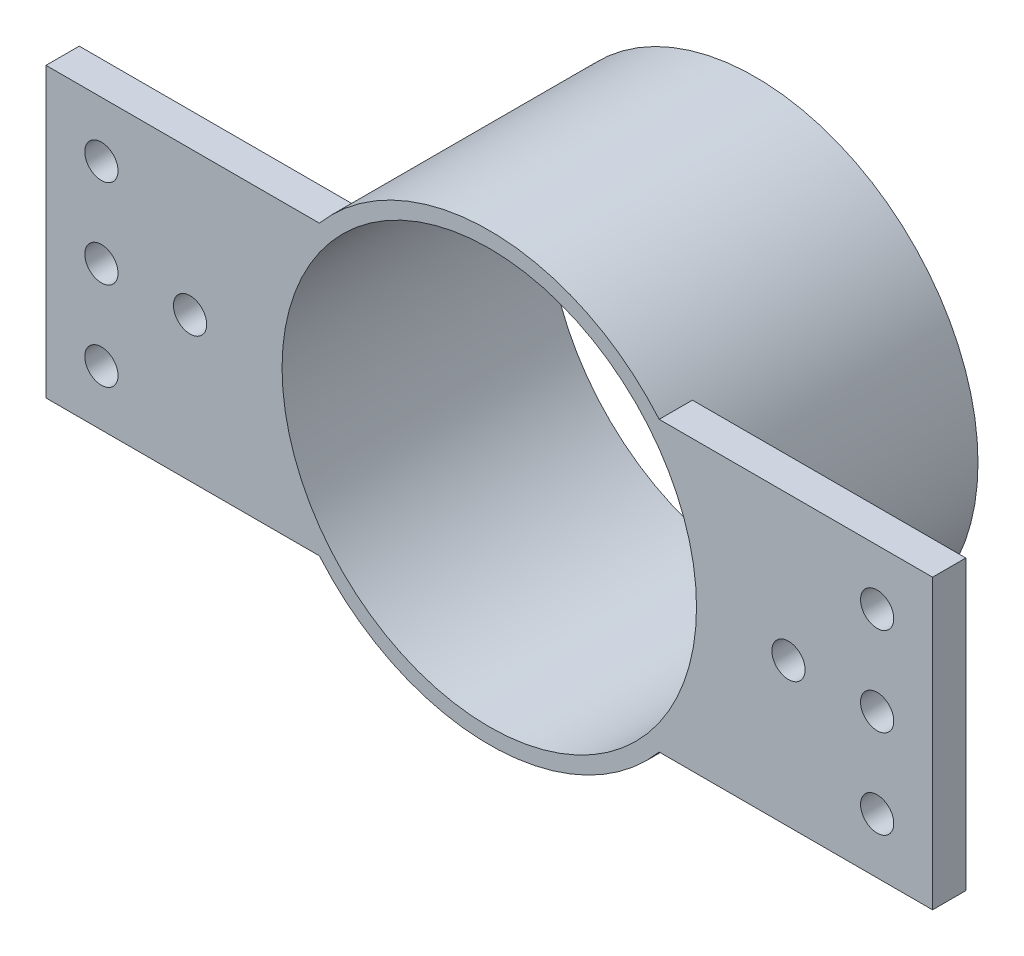
ISO-10303-21;
HEADER;
FILE_DESCRIPTION(('STEP AP214'),'2;1');
FILE_NAME('part.step','',(''),(''),'','','');
FILE_SCHEMA(('AUTOMOTIVE_DESIGN { 1 0 10303 214 1 1 1 1 }'));
ENDSEC;
DATA;
#1=APPLICATION_CONTEXT('core data for automotive mechanical design processes');
#2=APPLICATION_PROTOCOL_DEFINITION('international standard','automotive_design',2000,#1);
#3=PRODUCT_CONTEXT('',#1,'mechanical');
#4=PRODUCT('Part','Part','',(#3));
#5=PRODUCT_RELATED_PRODUCT_CATEGORY('part','',(#4));
#6=PRODUCT_DEFINITION_FORMATION('','',#4);
#7=PRODUCT_DEFINITION_CONTEXT('part definition',#1,'design');
#8=PRODUCT_DEFINITION('design','',#6,#7);
#9=PRODUCT_DEFINITION_SHAPE('','',#8);
#10=(LENGTH_UNIT() NAMED_UNIT(*) SI_UNIT(.MILLI.,.METRE.));
#11=(NAMED_UNIT(*) PLANE_ANGLE_UNIT() SI_UNIT($,.RADIAN.));
#12=(NAMED_UNIT(*) SI_UNIT($,.STERADIAN.) SOLID_ANGLE_UNIT());
#13=UNCERTAINTY_MEASURE_WITH_UNIT(LENGTH_MEASURE(1.E-05),#10,'distance_accuracy_value','');
#14=(GEOMETRIC_REPRESENTATION_CONTEXT(3) GLOBAL_UNCERTAINTY_ASSIGNED_CONTEXT((#13)) GLOBAL_UNIT_ASSIGNED_CONTEXT((#10,
#11,#12)) REPRESENTATION_CONTEXT('',''));
#15=CARTESIAN_POINT('',(0.,0.,0.));
#16=DIRECTION('',(0.,0.,1.));
#17=DIRECTION('',(1.,0.,0.));
#18=AXIS2_PLACEMENT_3D('',#15,#16,#17);
#19=CARTESIAN_POINT('',(0.,0.,0.));
#20=DIRECTION('',(0.,0.,1.));
#21=DIRECTION('',(1.,0.,0.));
#22=AXIS2_PLACEMENT_3D('',#19,#20,#21);
#23=PLANE('',#22);
#24=CARTESIAN_POINT('',(-35.,-8.,0.));
#25=DIRECTION('',(0.,0.,1.));
#26=DIRECTION('',(1.,0.,0.));
#27=AXIS2_PLACEMENT_3D('',#24,#25,#26);
#28=CIRCLE('',#27,1.5);
#29=CARTESIAN_POINT('',(-33.5,-8.,0.));
#30=VERTEX_POINT('',#29);
#31=EDGE_CURVE('E282',#30,#30,#28,.T.);
#32=ORIENTED_EDGE('',*,*,#31,.T.);
#33=EDGE_LOOP('',(#32));
#34=FACE_BOUND('',#33,.T.);
#35=CARTESIAN_POINT('',(-35.,8.,0.));
#36=DIRECTION('',(0.,0.,1.));
#37=DIRECTION('',(1.,0.,0.));
#38=AXIS2_PLACEMENT_3D('',#35,#36,#37);
#39=CIRCLE('',#38,1.5);
#40=CARTESIAN_POINT('',(-33.5,8.,0.));
#41=VERTEX_POINT('',#40);
#42=EDGE_CURVE('E276',#41,#41,#39,.T.);
#43=ORIENTED_EDGE('',*,*,#42,.T.);
#44=EDGE_LOOP('',(#43));
#45=FACE_BOUND('',#44,.T.);
#46=CARTESIAN_POINT('',(-27.,0.,0.));
#47=DIRECTION('',(0.,0.,1.));
#48=DIRECTION('',(1.,0.,0.));
#49=AXIS2_PLACEMENT_3D('',#46,#47,#48);
#50=CIRCLE('',#49,1.5);
#51=CARTESIAN_POINT('',(-25.5,0.,0.));
#52=VERTEX_POINT('',#51);
#53=EDGE_CURVE('E270',#52,#52,#50,.T.);
#54=ORIENTED_EDGE('',*,*,#53,.T.);
#55=EDGE_LOOP('',(#54));
#56=FACE_BOUND('',#55,.T.);
#57=CARTESIAN_POINT('',(-35.,0.,0.));
#58=DIRECTION('',(0.,0.,1.));
#59=DIRECTION('',(1.,0.,0.));
#60=AXIS2_PLACEMENT_3D('',#57,#58,#59);
#61=CIRCLE('',#60,1.5);
#62=CARTESIAN_POINT('',(-33.5,0.,0.));
#63=VERTEX_POINT('',#62);
#64=EDGE_CURVE('E265',#63,#63,#61,.T.);
#65=ORIENTED_EDGE('',*,*,#64,.T.);
#66=EDGE_LOOP('',(#65));
#67=FACE_BOUND('',#66,.T.);
#68=DIRECTION('',(-1.,0.,0.));
#69=VECTOR('',#68,1.);
#70=CARTESIAN_POINT('',(-40.,13.,0.));
#71=LINE('',#70,#69);
#72=CARTESIAN_POINT('',(-15.3300358773227,13.,0.));
#73=VERTEX_POINT('',#72);
#74=CARTESIAN_POINT('',(-40.,13.,0.));
#75=VERTEX_POINT('',#74);
#76=EDGE_CURVE('E141',#73,#75,#71,.T.);
#77=ORIENTED_EDGE('',*,*,#76,.F.);
#78=CARTESIAN_POINT('',(0.,0.,0.));
#79=DIRECTION('',(0.,0.,1.));
#80=DIRECTION('',(1.,0.,0.));
#81=AXIS2_PLACEMENT_3D('',#78,#79,#80);
#82=CIRCLE('',#81,20.1);
#83=CARTESIAN_POINT('',(-15.3300358773227,-13.,0.));
#84=VERTEX_POINT('',#83);
#85=EDGE_CURVE('E120',#73,#84,#82,.T.);
#86=ORIENTED_EDGE('',*,*,#85,.T.);
#87=DIRECTION('',(1.,0.,0.));
#88=VECTOR('',#87,1.);
#89=CARTESIAN_POINT('',(-40.,-13.,0.));
#90=LINE('',#89,#88);
#91=CARTESIAN_POINT('',(-40.,-13.,0.));
#92=VERTEX_POINT('',#91);
#93=EDGE_CURVE('E146',#92,#84,#90,.T.);
#94=ORIENTED_EDGE('',*,*,#93,.F.);
#95=DIRECTION('',(0.,-1.,0.));
#96=VECTOR('',#95,1.);
#97=CARTESIAN_POINT('',(-40.,13.,0.));
#98=LINE('',#97,#96);
#99=EDGE_CURVE('E144',#75,#92,#98,.T.);
#100=ORIENTED_EDGE('',*,*,#99,.F.);
#101=EDGE_LOOP('',(#77,#86,#94,#100));
#102=FACE_BOUND('',#101,.T.);
#103=ADVANCED_FACE('F34',(#34,#45,#56,#67,#102),#23,.F.);
#104=CARTESIAN_POINT('',(-40.,13.,3.));
#105=DIRECTION('',(0.,-1.,0.));
#106=DIRECTION('',(0.,0.,-1.));
#107=AXIS2_PLACEMENT_3D('',#104,#105,#106);
#108=PLANE('',#107);
#109=CARTESIAN_POINT('',(40.,13.,0.));
#110=VERTEX_POINT('',#109);
#111=CARTESIAN_POINT('',(15.3300358773227,13.,0.));
#112=VERTEX_POINT('',#111);
#113=EDGE_CURVE('E119',#110,#112,#71,.T.);
#114=ORIENTED_EDGE('',*,*,#113,.T.);
#115=DIRECTION('',(0.,0.,1.));
#116=VECTOR('',#115,1.);
#117=CARTESIAN_POINT('',(15.3300358773227,13.,-21.));
#118=LINE('',#117,#116);
#119=CARTESIAN_POINT('',(15.3300358773227,13.,3.));
#120=VERTEX_POINT('',#119);
#121=EDGE_CURVE('E110',#112,#120,#118,.T.);
#122=ORIENTED_EDGE('',*,*,#121,.T.);
#123=DIRECTION('',(-1.,0.,0.));
#124=VECTOR('',#123,1.);
#125=CARTESIAN_POINT('',(-40.,13.,3.));
#126=LINE('',#125,#124);
#127=CARTESIAN_POINT('',(40.,13.,3.));
#128=VERTEX_POINT('',#127);
#129=EDGE_CURVE('E85',#128,#120,#126,.T.);
#130=ORIENTED_EDGE('',*,*,#129,.F.);
#131=DIRECTION('',(0.,0.,-1.));
#132=VECTOR('',#131,1.);
#133=CARTESIAN_POINT('',(40.,13.,3.));
#134=LINE('',#133,#132);
#135=EDGE_CURVE('E156',#128,#110,#134,.T.);
#136=ORIENTED_EDGE('',*,*,#135,.T.);
#137=EDGE_LOOP('',(#114,#122,#130,#136));
#138=FACE_BOUND('',#137,.T.);
#139=ADVANCED_FACE('F118',(#138),#108,.F.);
#140=CARTESIAN_POINT('',(-40.,-13.,3.));
#141=DIRECTION('',(0.,1.,0.));
#142=DIRECTION('',(0.,0.,1.));
#143=AXIS2_PLACEMENT_3D('',#140,#141,#142);
#144=PLANE('',#143);
#145=ORIENTED_EDGE('',*,*,#93,.T.);
#146=DIRECTION('',(0.,0.,1.));
#147=VECTOR('',#146,1.);
#148=CARTESIAN_POINT('',(-15.3300358773227,-13.,-21.));
#149=LINE('',#148,#147);
#150=CARTESIAN_POINT('',(-15.3300358773227,-13.,3.));
#151=VERTEX_POINT('',#150);
#152=EDGE_CURVE('E11',#84,#151,#149,.T.);
#153=ORIENTED_EDGE('',*,*,#152,.T.);
#154=DIRECTION('',(1.,0.,0.));
#155=VECTOR('',#154,1.);
#156=CARTESIAN_POINT('',(-40.,-13.,3.));
#157=LINE('',#156,#155);
#158=CARTESIAN_POINT('',(-40.,-13.,3.));
#159=VERTEX_POINT('',#158);
#160=EDGE_CURVE('E135',#159,#151,#157,.T.);
#161=ORIENTED_EDGE('',*,*,#160,.F.);
#162=DIRECTION('',(0.,0.,-1.));
#163=VECTOR('',#162,1.);
#164=CARTESIAN_POINT('',(-40.,-13.,3.));
#165=LINE('',#164,#163);
#166=EDGE_CURVE('E150',#159,#92,#165,.T.);
#167=ORIENTED_EDGE('',*,*,#166,.T.);
#168=EDGE_LOOP('',(#145,#153,#161,#167));
#169=FACE_BOUND('',#168,.T.);
#170=ADVANCED_FACE('F177',(#169),#144,.F.);
#171=CARTESIAN_POINT('',(0.,0.,3.));
#172=DIRECTION('',(0.,0.,1.));
#173=DIRECTION('',(1.,0.,0.));
#174=AXIS2_PLACEMENT_3D('',#171,#172,#173);
#175=PLANE('',#174);
#176=CARTESIAN_POINT('',(0.,0.,3.));
#177=DIRECTION('',(0.,0.,1.));
#178=DIRECTION('',(1.,0.,0.));
#179=AXIS2_PLACEMENT_3D('',#176,#177,#178);
#180=CIRCLE('',#179,18.7);
#181=CARTESIAN_POINT('',(18.7,0.,3.));
#182=VERTEX_POINT('',#181);
#183=EDGE_CURVE('E208',#182,#182,#180,.T.);
#184=ORIENTED_EDGE('',*,*,#183,.F.);
#185=EDGE_LOOP('',(#184));
#186=FACE_BOUND('',#185,.T.);
#187=ORIENTED_EDGE('',*,*,#129,.T.);
#188=CARTESIAN_POINT('',(0.,0.,3.));
#189=DIRECTION('',(0.,0.,1.));
#190=DIRECTION('',(1.,0.,0.));
#191=AXIS2_PLACEMENT_3D('',#188,#189,#190);
#192=CIRCLE('',#191,20.1);
#193=CARTESIAN_POINT('',(-15.3300358773227,13.,3.));
#194=VERTEX_POINT('',#193);
#195=EDGE_CURVE('E108',#120,#194,#192,.T.);
#196=ORIENTED_EDGE('',*,*,#195,.T.);
#197=CARTESIAN_POINT('',(-40.,13.,3.));
#198=VERTEX_POINT('',#197);
#199=EDGE_CURVE('E129',#194,#198,#126,.T.);
#200=ORIENTED_EDGE('',*,*,#199,.T.);
#201=DIRECTION('',(0.,-1.,0.));
#202=VECTOR('',#201,1.);
#203=CARTESIAN_POINT('',(-40.,13.,3.));
#204=LINE('',#203,#202);
#205=EDGE_CURVE('E128',#198,#159,#204,.T.);
#206=ORIENTED_EDGE('',*,*,#205,.T.);
#207=ORIENTED_EDGE('',*,*,#160,.T.);
#208=CARTESIAN_POINT('',(15.3300358773227,-13.,3.));
#209=VERTEX_POINT('',#208);
#210=EDGE_CURVE('E49',#151,#209,#192,.T.);
#211=ORIENTED_EDGE('',*,*,#210,.T.);
#212=CARTESIAN_POINT('',(40.,-13.,3.));
#213=VERTEX_POINT('',#212);
#214=EDGE_CURVE('E55',#209,#213,#157,.T.);
#215=ORIENTED_EDGE('',*,*,#214,.T.);
#216=DIRECTION('',(0.,1.,0.));
#217=VECTOR('',#216,1.);
#218=CARTESIAN_POINT('',(40.,13.,3.));
#219=LINE('',#218,#217);
#220=EDGE_CURVE('E126',#213,#128,#219,.T.);
#221=ORIENTED_EDGE('',*,*,#220,.T.);
#222=EDGE_LOOP('',(#187,#196,#200,#206,#207,#211,#215,#221));
#223=FACE_BOUND('',#222,.T.);
#224=CARTESIAN_POINT('',(35.,0.,3.));
#225=DIRECTION('',(0.,0.,1.));
#226=DIRECTION('',(-1.,0.,0.));
#227=AXIS2_PLACEMENT_3D('',#224,#225,#226);
#228=CIRCLE('',#227,1.5);
#229=CARTESIAN_POINT('',(33.5,0.,3.));
#230=VERTEX_POINT('',#229);
#231=EDGE_CURVE('E296',#230,#230,#228,.T.);
#232=ORIENTED_EDGE('',*,*,#231,.F.);
#233=EDGE_LOOP('',(#232));
#234=FACE_BOUND('',#233,.T.);
#235=CARTESIAN_POINT('',(35.,-7.99999999999999,3.));
#236=DIRECTION('',(0.,0.,1.));
#237=DIRECTION('',(-1.,0.,0.));
#238=AXIS2_PLACEMENT_3D('',#235,#236,#237);
#239=CIRCLE('',#238,1.5);
#240=CARTESIAN_POINT('',(33.5,-7.99999999999999,3.));
#241=VERTEX_POINT('',#240);
#242=EDGE_CURVE('E284',#241,#241,#239,.T.);
#243=ORIENTED_EDGE('',*,*,#242,.F.);
#244=EDGE_LOOP('',(#243));
#245=FACE_BOUND('',#244,.T.);
#246=CARTESIAN_POINT('',(35.,8.,3.));
#247=DIRECTION('',(0.,0.,1.));
#248=DIRECTION('',(-1.,0.,0.));
#249=AXIS2_PLACEMENT_3D('',#246,#247,#248);
#250=CIRCLE('',#249,1.5);
#251=CARTESIAN_POINT('',(33.5,8.,3.));
#252=VERTEX_POINT('',#251);
#253=EDGE_CURVE('E290',#252,#252,#250,.T.);
#254=ORIENTED_EDGE('',*,*,#253,.F.);
#255=EDGE_LOOP('',(#254));
#256=FACE_BOUND('',#255,.T.);
#257=CARTESIAN_POINT('',(27.,0.,3.));
#258=DIRECTION('',(0.,0.,1.));
#259=DIRECTION('',(-1.,0.,0.));
#260=AXIS2_PLACEMENT_3D('',#257,#258,#259);
#261=CIRCLE('',#260,1.5);
#262=CARTESIAN_POINT('',(25.5,0.,3.));
#263=VERTEX_POINT('',#262);
#264=EDGE_CURVE('E302',#263,#263,#261,.T.);
#265=ORIENTED_EDGE('',*,*,#264,.F.);
#266=EDGE_LOOP('',(#265));
#267=FACE_BOUND('',#266,.T.);
#268=CARTESIAN_POINT('',(-35.,-8.,3.));
#269=DIRECTION('',(0.,0.,1.));
#270=DIRECTION('',(1.,0.,0.));
#271=AXIS2_PLACEMENT_3D('',#268,#269,#270);
#272=CIRCLE('',#271,1.5);
#273=CARTESIAN_POINT('',(-33.5,-8.,3.));
#274=VERTEX_POINT('',#273);
#275=EDGE_CURVE('E279',#274,#274,#272,.T.);
#276=ORIENTED_EDGE('',*,*,#275,.F.);
#277=EDGE_LOOP('',(#276));
#278=FACE_BOUND('',#277,.T.);
#279=CARTESIAN_POINT('',(-27.,0.,3.));
#280=DIRECTION('',(0.,0.,1.));
#281=DIRECTION('',(1.,0.,0.));
#282=AXIS2_PLACEMENT_3D('',#279,#280,#281);
#283=CIRCLE('',#282,1.5);
#284=CARTESIAN_POINT('',(-25.5,0.,3.));
#285=VERTEX_POINT('',#284);
#286=EDGE_CURVE('E267',#285,#285,#283,.T.);
#287=ORIENTED_EDGE('',*,*,#286,.F.);
#288=EDGE_LOOP('',(#287));
#289=FACE_BOUND('',#288,.T.);
#290=CARTESIAN_POINT('',(-35.,0.,3.));
#291=DIRECTION('',(0.,0.,1.));
#292=DIRECTION('',(1.,0.,0.));
#293=AXIS2_PLACEMENT_3D('',#290,#291,#292);
#294=CIRCLE('',#293,1.5);
#295=CARTESIAN_POINT('',(-33.5,0.,3.));
#296=VERTEX_POINT('',#295);
#297=EDGE_CURVE('E142',#296,#296,#294,.T.);
#298=ORIENTED_EDGE('',*,*,#297,.F.);
#299=EDGE_LOOP('',(#298));
#300=FACE_BOUND('',#299,.T.);
#301=CARTESIAN_POINT('',(-35.,8.,3.));
#302=DIRECTION('',(0.,0.,1.));
#303=DIRECTION('',(1.,0.,0.));
#304=AXIS2_PLACEMENT_3D('',#301,#302,#303);
#305=CIRCLE('',#304,1.5);
#306=CARTESIAN_POINT('',(-33.5,8.,3.));
#307=VERTEX_POINT('',#306);
#308=EDGE_CURVE('E274',#307,#307,#305,.T.);
#309=ORIENTED_EDGE('',*,*,#308,.F.);
#310=EDGE_LOOP('',(#309));
#311=FACE_BOUND('',#310,.T.);
#312=ADVANCED_FACE('F123',(#186,#223,#234,#245,#256,#267,#278,#289,#300,#311),#175,.T.);
#313=CARTESIAN_POINT('',(15.3300358773227,-13.,0.));
#314=VERTEX_POINT('',#313);
#315=CARTESIAN_POINT('',(40.,-13.,0.));
#316=VERTEX_POINT('',#315);
#317=EDGE_CURVE('E77',#314,#316,#90,.T.);
#318=ORIENTED_EDGE('',*,*,#317,.F.);
#319=EDGE_CURVE('E121',#314,#112,#82,.T.);
#320=ORIENTED_EDGE('',*,*,#319,.T.);
#321=ORIENTED_EDGE('',*,*,#113,.F.);
#322=DIRECTION('',(0.,1.,0.));
#323=VECTOR('',#322,1.);
#324=CARTESIAN_POINT('',(40.,13.,0.));
#325=LINE('',#324,#323);
#326=EDGE_CURVE('E138',#316,#110,#325,.T.);
#327=ORIENTED_EDGE('',*,*,#326,.F.);
#328=EDGE_LOOP('',(#318,#320,#321,#327));
#329=FACE_BOUND('',#328,.T.);
#330=CARTESIAN_POINT('',(35.,-7.99999999999999,0.));
#331=DIRECTION('',(0.,0.,1.));
#332=DIRECTION('',(-1.,0.,0.));
#333=AXIS2_PLACEMENT_3D('',#330,#331,#332);
#334=CIRCLE('',#333,1.5);
#335=CARTESIAN_POINT('',(33.5,-7.99999999999999,0.));
#336=VERTEX_POINT('',#335);
#337=EDGE_CURVE('E287',#336,#336,#334,.T.);
#338=ORIENTED_EDGE('',*,*,#337,.T.);
#339=EDGE_LOOP('',(#338));
#340=FACE_BOUND('',#339,.T.);
#341=CARTESIAN_POINT('',(35.,8.,0.));
#342=DIRECTION('',(0.,0.,1.));
#343=DIRECTION('',(-1.,0.,0.));
#344=AXIS2_PLACEMENT_3D('',#341,#342,#343);
#345=CIRCLE('',#344,1.5);
#346=CARTESIAN_POINT('',(33.5,8.,0.));
#347=VERTEX_POINT('',#346);
#348=EDGE_CURVE('E293',#347,#347,#345,.T.);
#349=ORIENTED_EDGE('',*,*,#348,.T.);
#350=EDGE_LOOP('',(#349));
#351=FACE_BOUND('',#350,.T.);
#352=CARTESIAN_POINT('',(35.,0.,0.));
#353=DIRECTION('',(0.,0.,1.));
#354=DIRECTION('',(-1.,0.,0.));
#355=AXIS2_PLACEMENT_3D('',#352,#353,#354);
#356=CIRCLE('',#355,1.5);
#357=CARTESIAN_POINT('',(33.5,0.,0.));
#358=VERTEX_POINT('',#357);
#359=EDGE_CURVE('E299',#358,#358,#356,.T.);
#360=ORIENTED_EDGE('',*,*,#359,.T.);
#361=EDGE_LOOP('',(#360));
#362=FACE_BOUND('',#361,.T.);
#363=CARTESIAN_POINT('',(27.,0.,0.));
#364=DIRECTION('',(0.,0.,1.));
#365=DIRECTION('',(-1.,0.,0.));
#366=AXIS2_PLACEMENT_3D('',#363,#364,#365);
#367=CIRCLE('',#366,1.5);
#368=CARTESIAN_POINT('',(25.5,0.,0.));
#369=VERTEX_POINT('',#368);
#370=EDGE_CURVE('E201',#369,#369,#367,.T.);
#371=ORIENTED_EDGE('',*,*,#370,.T.);
#372=EDGE_LOOP('',(#371));
#373=FACE_BOUND('',#372,.T.);
#374=ADVANCED_FACE('F160',(#329,#340,#351,#362,#373),#23,.F.);
#375=CARTESIAN_POINT('',(40.,13.,3.));
#376=DIRECTION('',(-1.,0.,0.));
#377=DIRECTION('',(0.,0.,1.));
#378=AXIS2_PLACEMENT_3D('',#375,#376,#377);
#379=PLANE('',#378);
#380=ORIENTED_EDGE('',*,*,#326,.T.);
#381=ORIENTED_EDGE('',*,*,#135,.F.);
#382=ORIENTED_EDGE('',*,*,#220,.F.);
#383=DIRECTION('',(0.,0.,-1.));
#384=VECTOR('',#383,1.);
#385=CARTESIAN_POINT('',(40.,-13.,3.));
#386=LINE('',#385,#384);
#387=EDGE_CURVE('E137',#213,#316,#386,.T.);
#388=ORIENTED_EDGE('',*,*,#387,.T.);
#389=EDGE_LOOP('',(#380,#381,#382,#388));
#390=FACE_BOUND('',#389,.T.);
#391=ADVANCED_FACE('F36',(#390),#379,.F.);
#392=ORIENTED_EDGE('',*,*,#199,.F.);
#393=DIRECTION('',(0.,0.,1.));
#394=VECTOR('',#393,1.);
#395=CARTESIAN_POINT('',(-15.3300358773227,13.,-21.));
#396=LINE('',#395,#394);
#397=EDGE_CURVE('E113',#194,#73,#396,.F.);
#398=ORIENTED_EDGE('',*,*,#397,.T.);
#399=ORIENTED_EDGE('',*,*,#76,.T.);
#400=DIRECTION('',(0.,0.,-1.));
#401=VECTOR('',#400,1.);
#402=CARTESIAN_POINT('',(-40.,13.,3.));
#403=LINE('',#402,#401);
#404=EDGE_CURVE('E153',#198,#75,#403,.T.);
#405=ORIENTED_EDGE('',*,*,#404,.F.);
#406=EDGE_LOOP('',(#392,#398,#399,#405));
#407=FACE_BOUND('',#406,.T.);
#408=ADVANCED_FACE('F164',(#407),#108,.F.);
#409=CARTESIAN_POINT('',(-40.,13.,3.));
#410=DIRECTION('',(1.,0.,0.));
#411=DIRECTION('',(0.,1.,0.));
#412=AXIS2_PLACEMENT_3D('',#409,#410,#411);
#413=PLANE('',#412);
#414=ORIENTED_EDGE('',*,*,#99,.T.);
#415=ORIENTED_EDGE('',*,*,#166,.F.);
#416=ORIENTED_EDGE('',*,*,#205,.F.);
#417=ORIENTED_EDGE('',*,*,#404,.T.);
#418=EDGE_LOOP('',(#414,#415,#416,#417));
#419=FACE_BOUND('',#418,.T.);
#420=ADVANCED_FACE('F169',(#419),#413,.F.);
#421=ORIENTED_EDGE('',*,*,#214,.F.);
#422=DIRECTION('',(0.,0.,1.));
#423=VECTOR('',#422,1.);
#424=CARTESIAN_POINT('',(15.3300358773227,-13.,-21.));
#425=LINE('',#424,#423);
#426=EDGE_CURVE('E42',#209,#314,#425,.F.);
#427=ORIENTED_EDGE('',*,*,#426,.T.);
#428=ORIENTED_EDGE('',*,*,#317,.T.);
#429=ORIENTED_EDGE('',*,*,#387,.F.);
#430=EDGE_LOOP('',(#421,#427,#428,#429));
#431=FACE_BOUND('',#430,.T.);
#432=ADVANCED_FACE('F157',(#431),#144,.F.);
#433=CARTESIAN_POINT('',(-35.,0.,3.));
#434=DIRECTION('',(0.,0.,-1.));
#435=DIRECTION('',(-1.,0.,0.));
#436=AXIS2_PLACEMENT_3D('',#433,#434,#435);
#437=CYLINDRICAL_SURFACE('',#436,1.5);
#438=ORIENTED_EDGE('',*,*,#297,.T.);
#439=EDGE_LOOP('',(#438));
#440=FACE_BOUND('',#439,.T.);
#441=ORIENTED_EDGE('',*,*,#64,.F.);
#442=EDGE_LOOP('',(#441));
#443=FACE_BOUND('',#442,.T.);
#444=ADVANCED_FACE('F185',(#440,#443),#437,.F.);
#445=CARTESIAN_POINT('',(-27.,0.,3.));
#446=DIRECTION('',(0.,0.,-1.));
#447=DIRECTION('',(-1.,0.,0.));
#448=AXIS2_PLACEMENT_3D('',#445,#446,#447);
#449=CYLINDRICAL_SURFACE('',#448,1.5);
#450=ORIENTED_EDGE('',*,*,#286,.T.);
#451=EDGE_LOOP('',(#450));
#452=FACE_BOUND('',#451,.T.);
#453=ORIENTED_EDGE('',*,*,#53,.F.);
#454=EDGE_LOOP('',(#453));
#455=FACE_BOUND('',#454,.T.);
#456=ADVANCED_FACE('F252',(#452,#455),#449,.F.);
#457=CARTESIAN_POINT('',(-35.,8.,3.));
#458=DIRECTION('',(0.,0.,-1.));
#459=DIRECTION('',(-1.,0.,0.));
#460=AXIS2_PLACEMENT_3D('',#457,#458,#459);
#461=CYLINDRICAL_SURFACE('',#460,1.5);
#462=ORIENTED_EDGE('',*,*,#308,.T.);
#463=EDGE_LOOP('',(#462));
#464=FACE_BOUND('',#463,.T.);
#465=ORIENTED_EDGE('',*,*,#42,.F.);
#466=EDGE_LOOP('',(#465));
#467=FACE_BOUND('',#466,.T.);
#468=ADVANCED_FACE('F248',(#464,#467),#461,.F.);
#469=CARTESIAN_POINT('',(-35.,-8.,3.));
#470=DIRECTION('',(0.,0.,-1.));
#471=DIRECTION('',(-1.,0.,0.));
#472=AXIS2_PLACEMENT_3D('',#469,#470,#471);
#473=CYLINDRICAL_SURFACE('',#472,1.5);
#474=ORIENTED_EDGE('',*,*,#275,.T.);
#475=EDGE_LOOP('',(#474));
#476=FACE_BOUND('',#475,.T.);
#477=ORIENTED_EDGE('',*,*,#31,.F.);
#478=EDGE_LOOP('',(#477));
#479=FACE_BOUND('',#478,.T.);
#480=ADVANCED_FACE('F244',(#476,#479),#473,.F.);
#481=CARTESIAN_POINT('',(35.,-7.99999999999999,3.));
#482=DIRECTION('',(0.,0.,-1.));
#483=DIRECTION('',(-1.,0.,0.));
#484=AXIS2_PLACEMENT_3D('',#481,#482,#483);
#485=CYLINDRICAL_SURFACE('',#484,1.5);
#486=ORIENTED_EDGE('',*,*,#242,.T.);
#487=EDGE_LOOP('',(#486));
#488=FACE_BOUND('',#487,.T.);
#489=ORIENTED_EDGE('',*,*,#337,.F.);
#490=EDGE_LOOP('',(#489));
#491=FACE_BOUND('',#490,.T.);
#492=ADVANCED_FACE('F240',(#488,#491),#485,.F.);
#493=CARTESIAN_POINT('',(35.,8.,3.));
#494=DIRECTION('',(0.,0.,-1.));
#495=DIRECTION('',(-1.,0.,0.));
#496=AXIS2_PLACEMENT_3D('',#493,#494,#495);
#497=CYLINDRICAL_SURFACE('',#496,1.5);
#498=ORIENTED_EDGE('',*,*,#253,.T.);
#499=EDGE_LOOP('',(#498));
#500=FACE_BOUND('',#499,.T.);
#501=ORIENTED_EDGE('',*,*,#348,.F.);
#502=EDGE_LOOP('',(#501));
#503=FACE_BOUND('',#502,.T.);
#504=ADVANCED_FACE('F236',(#500,#503),#497,.F.);
#505=CARTESIAN_POINT('',(35.,0.,3.));
#506=DIRECTION('',(0.,0.,-1.));
#507=DIRECTION('',(-1.,0.,0.));
#508=AXIS2_PLACEMENT_3D('',#505,#506,#507);
#509=CYLINDRICAL_SURFACE('',#508,1.5);
#510=ORIENTED_EDGE('',*,*,#231,.T.);
#511=EDGE_LOOP('',(#510));
#512=FACE_BOUND('',#511,.T.);
#513=ORIENTED_EDGE('',*,*,#359,.F.);
#514=EDGE_LOOP('',(#513));
#515=FACE_BOUND('',#514,.T.);
#516=ADVANCED_FACE('F232',(#512,#515),#509,.F.);
#517=CARTESIAN_POINT('',(27.,0.,3.));
#518=DIRECTION('',(0.,0.,-1.));
#519=DIRECTION('',(-1.,0.,0.));
#520=AXIS2_PLACEMENT_3D('',#517,#518,#519);
#521=CYLINDRICAL_SURFACE('',#520,1.5);
#522=ORIENTED_EDGE('',*,*,#264,.T.);
#523=EDGE_LOOP('',(#522));
#524=FACE_BOUND('',#523,.T.);
#525=ORIENTED_EDGE('',*,*,#370,.F.);
#526=EDGE_LOOP('',(#525));
#527=FACE_BOUND('',#526,.T.);
#528=ADVANCED_FACE('F227',(#524,#527),#521,.F.);
#529=CARTESIAN_POINT('',(0.,0.,-21.));
#530=DIRECTION('',(0.,0.,1.));
#531=DIRECTION('',(1.,0.,0.));
#532=AXIS2_PLACEMENT_3D('',#529,#530,#531);
#533=CYLINDRICAL_SURFACE('',#532,20.1);
#534=CARTESIAN_POINT('',(0.,0.,-21.));
#535=DIRECTION('',(0.,0.,1.));
#536=DIRECTION('',(1.,0.,0.));
#537=AXIS2_PLACEMENT_3D('',#534,#535,#536);
#538=CIRCLE('',#537,20.1);
#539=CARTESIAN_POINT('',(20.1,0.,-21.));
#540=VERTEX_POINT('',#539);
#541=EDGE_CURVE('E115',#540,#540,#538,.T.);
#542=ORIENTED_EDGE('',*,*,#541,.T.);
#543=EDGE_LOOP('',(#542));
#544=FACE_BOUND('',#543,.T.);
#545=ORIENTED_EDGE('',*,*,#397,.F.);
#546=ORIENTED_EDGE('',*,*,#195,.F.);
#547=ORIENTED_EDGE('',*,*,#121,.F.);
#548=ORIENTED_EDGE('',*,*,#319,.F.);
#549=ORIENTED_EDGE('',*,*,#426,.F.);
#550=ORIENTED_EDGE('',*,*,#210,.F.);
#551=ORIENTED_EDGE('',*,*,#152,.F.);
#552=ORIENTED_EDGE('',*,*,#85,.F.);
#553=EDGE_LOOP('',(#545,#546,#547,#548,#549,#550,#551,#552));
#554=FACE_BOUND('',#553,.T.);
#555=ADVANCED_FACE('F109',(#544,#554),#533,.T.);
#556=CARTESIAN_POINT('',(0.,0.,-21.));
#557=DIRECTION('',(0.,0.,1.));
#558=DIRECTION('',(1.,0.,0.));
#559=AXIS2_PLACEMENT_3D('',#556,#557,#558);
#560=PLANE('',#559);
#561=CARTESIAN_POINT('',(0.,0.,-21.));
#562=DIRECTION('',(0.,0.,-1.));
#563=DIRECTION('',(-1.,0.,0.));
#564=AXIS2_PLACEMENT_3D('',#561,#562,#563);
#565=CIRCLE('',#564,18.7);
#566=CARTESIAN_POINT('',(-18.7,0.,-21.));
#567=VERTEX_POINT('',#566);
#568=EDGE_CURVE('E211',#567,#567,#565,.T.);
#569=ORIENTED_EDGE('',*,*,#568,.F.);
#570=EDGE_LOOP('',(#569));
#571=FACE_BOUND('',#570,.T.);
#572=ORIENTED_EDGE('',*,*,#541,.F.);
#573=EDGE_LOOP('',(#572));
#574=FACE_BOUND('',#573,.T.);
#575=ADVANCED_FACE('F217',(#571,#574),#560,.F.);
#576=CARTESIAN_POINT('',(0.,0.,4.));
#577=DIRECTION('',(0.,0.,-1.));
#578=DIRECTION('',(-1.,0.,0.));
#579=AXIS2_PLACEMENT_3D('',#576,#577,#578);
#580=CYLINDRICAL_SURFACE('',#579,18.7);
#581=ORIENTED_EDGE('',*,*,#183,.T.);
#582=EDGE_LOOP('',(#581));
#583=FACE_BOUND('',#582,.T.);
#584=ORIENTED_EDGE('',*,*,#568,.T.);
#585=EDGE_LOOP('',(#584));
#586=FACE_BOUND('',#585,.T.);
#587=ADVANCED_FACE('F215',(#583,#586),#580,.F.);
#588=CLOSED_SHELL('',(#103,#139,#170,#312,#374,#391,#408,#420,#432,#444,#456,#468,#480,#492,
#504,#516,#528,#555,#575,#587));
#589=MANIFOLD_SOLID_BREP('B2',#588);
#590=ADVANCED_BREP_SHAPE_REPRESENTATION('',(#18,#589),#14);
#591=SHAPE_DEFINITION_REPRESENTATION(#9,#590);
ENDSEC;
END-ISO-10303-21;
